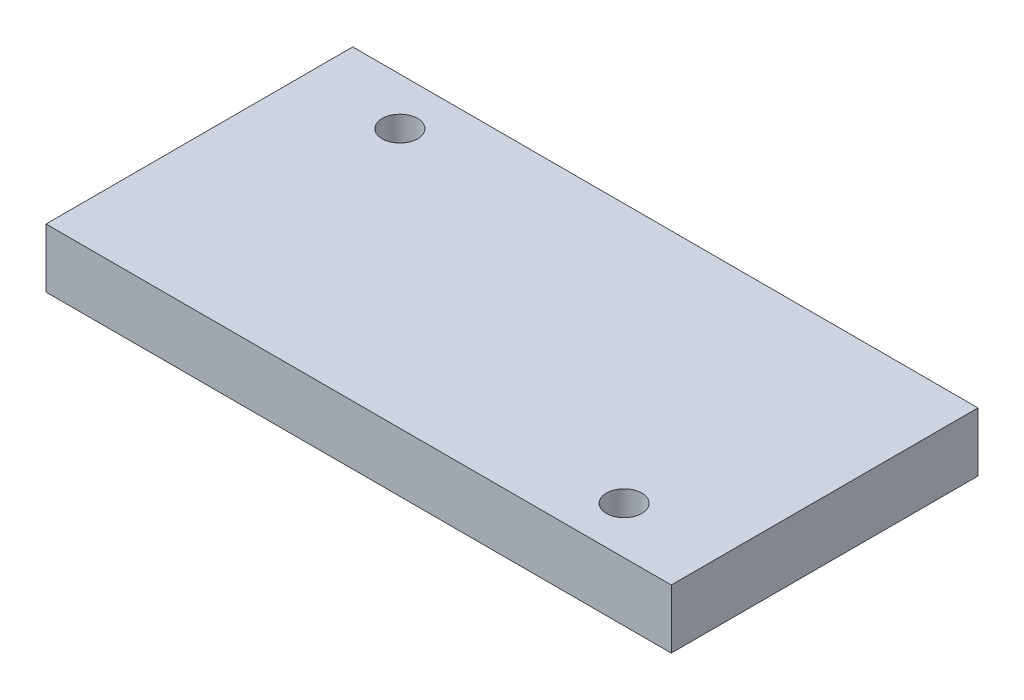
ISO-10303-21;
HEADER;
FILE_DESCRIPTION(('STEP AP214'),'2;1');
FILE_NAME('part.step','',(''),(''),'','','');
FILE_SCHEMA(('AUTOMOTIVE_DESIGN { 1 0 10303 214 1 1 1 1 }'));
ENDSEC;
DATA;
#1=APPLICATION_CONTEXT('core data for automotive mechanical design processes');
#2=APPLICATION_PROTOCOL_DEFINITION('international standard','automotive_design',2000,#1);
#3=PRODUCT_CONTEXT('',#1,'mechanical');
#4=PRODUCT('Part','Part','',(#3));
#5=PRODUCT_RELATED_PRODUCT_CATEGORY('part','',(#4));
#6=PRODUCT_DEFINITION_FORMATION('','',#4);
#7=PRODUCT_DEFINITION_CONTEXT('part definition',#1,'design');
#8=PRODUCT_DEFINITION('design','',#6,#7);
#9=PRODUCT_DEFINITION_SHAPE('','',#8);
#10=(LENGTH_UNIT() NAMED_UNIT(*) SI_UNIT(.MILLI.,.METRE.));
#11=(NAMED_UNIT(*) PLANE_ANGLE_UNIT() SI_UNIT($,.RADIAN.));
#12=(NAMED_UNIT(*) SI_UNIT($,.STERADIAN.) SOLID_ANGLE_UNIT());
#13=UNCERTAINTY_MEASURE_WITH_UNIT(LENGTH_MEASURE(1.E-05),#10,'distance_accuracy_value','');
#14=(GEOMETRIC_REPRESENTATION_CONTEXT(3) GLOBAL_UNCERTAINTY_ASSIGNED_CONTEXT((#13)) GLOBAL_UNIT_ASSIGNED_CONTEXT((#10,
#11,#12)) REPRESENTATION_CONTEXT('',''));
#15=CARTESIAN_POINT('',(0.,0.,0.));
#16=DIRECTION('',(0.,0.,1.));
#17=DIRECTION('',(1.,0.,0.));
#18=AXIS2_PLACEMENT_3D('',#15,#16,#17);
#19=CARTESIAN_POINT('',(26.5,5.,13.));
#20=DIRECTION('',(-1.,0.,0.));
#21=DIRECTION('',(0.,0.,1.));
#22=AXIS2_PLACEMENT_3D('',#19,#20,#21);
#23=PLANE('',#22);
#24=DIRECTION('',(0.,0.,-1.));
#25=VECTOR('',#24,1.);
#26=CARTESIAN_POINT('',(26.5,0.,13.));
#27=LINE('',#26,#25);
#28=CARTESIAN_POINT('',(26.5,0.,13.));
#29=VERTEX_POINT('',#28);
#30=CARTESIAN_POINT('',(26.5,0.,-13.));
#31=VERTEX_POINT('',#30);
#32=EDGE_CURVE('E104',#29,#31,#27,.T.);
#33=ORIENTED_EDGE('',*,*,#32,.T.);
#34=DIRECTION('',(0.,-1.,0.));
#35=VECTOR('',#34,1.);
#36=CARTESIAN_POINT('',(26.5,5.,-13.));
#37=LINE('',#36,#35);
#38=CARTESIAN_POINT('',(26.5,5.,-13.));
#39=VERTEX_POINT('',#38);
#40=EDGE_CURVE('E11',#39,#31,#37,.T.);
#41=ORIENTED_EDGE('',*,*,#40,.F.);
#42=DIRECTION('',(0.,0.,-1.));
#43=VECTOR('',#42,1.);
#44=CARTESIAN_POINT('',(26.5,5.,13.));
#45=LINE('',#44,#43);
#46=CARTESIAN_POINT('',(26.5,5.,13.));
#47=VERTEX_POINT('',#46);
#48=EDGE_CURVE('E91',#47,#39,#45,.T.);
#49=ORIENTED_EDGE('',*,*,#48,.F.);
#50=DIRECTION('',(0.,-1.,0.));
#51=VECTOR('',#50,1.);
#52=CARTESIAN_POINT('',(26.5,5.,13.));
#53=LINE('',#52,#51);
#54=EDGE_CURVE('E100',#47,#29,#53,.T.);
#55=ORIENTED_EDGE('',*,*,#54,.T.);
#56=EDGE_LOOP('',(#33,#41,#49,#55));
#57=FACE_BOUND('',#56,.T.);
#58=ADVANCED_FACE('F38',(#57),#23,.F.);
#59=CARTESIAN_POINT('',(-26.5,5.,-13.));
#60=DIRECTION('',(0.,0.,1.));
#61=DIRECTION('',(1.,0.,0.));
#62=AXIS2_PLACEMENT_3D('',#59,#60,#61);
#63=PLANE('',#62);
#64=DIRECTION('',(-1.,0.,0.));
#65=VECTOR('',#64,1.);
#66=CARTESIAN_POINT('',(-26.5,0.,-13.));
#67=LINE('',#66,#65);
#68=CARTESIAN_POINT('',(-26.5,0.,-13.));
#69=VERTEX_POINT('',#68);
#70=EDGE_CURVE('E95',#31,#69,#67,.T.);
#71=ORIENTED_EDGE('',*,*,#70,.T.);
#72=DIRECTION('',(0.,-1.,0.));
#73=VECTOR('',#72,1.);
#74=CARTESIAN_POINT('',(-26.5,5.,-13.));
#75=LINE('',#74,#73);
#76=CARTESIAN_POINT('',(-26.5,5.,-13.));
#77=VERTEX_POINT('',#76);
#78=EDGE_CURVE('E47',#77,#69,#75,.T.);
#79=ORIENTED_EDGE('',*,*,#78,.F.);
#80=DIRECTION('',(-1.,0.,0.));
#81=VECTOR('',#80,1.);
#82=CARTESIAN_POINT('',(-26.5,5.,-13.));
#83=LINE('',#82,#81);
#84=EDGE_CURVE('E86',#39,#77,#83,.T.);
#85=ORIENTED_EDGE('',*,*,#84,.F.);
#86=ORIENTED_EDGE('',*,*,#40,.T.);
#87=EDGE_LOOP('',(#71,#79,#85,#86));
#88=FACE_BOUND('',#87,.T.);
#89=ADVANCED_FACE('F94',(#88),#63,.F.);
#90=CARTESIAN_POINT('',(-26.5,5.,13.));
#91=DIRECTION('',(1.,0.,0.));
#92=DIRECTION('',(0.,0.,-1.));
#93=AXIS2_PLACEMENT_3D('',#90,#91,#92);
#94=PLANE('',#93);
#95=DIRECTION('',(0.,0.,1.));
#96=VECTOR('',#95,1.);
#97=CARTESIAN_POINT('',(-26.5,0.,13.));
#98=LINE('',#97,#96);
#99=CARTESIAN_POINT('',(-26.5,0.,13.));
#100=VERTEX_POINT('',#99);
#101=EDGE_CURVE('E73',#69,#100,#98,.T.);
#102=ORIENTED_EDGE('',*,*,#101,.T.);
#103=DIRECTION('',(0.,-1.,0.));
#104=VECTOR('',#103,1.);
#105=CARTESIAN_POINT('',(-26.5,5.,13.));
#106=LINE('',#105,#104);
#107=CARTESIAN_POINT('',(-26.5,5.,13.));
#108=VERTEX_POINT('',#107);
#109=EDGE_CURVE('E96',#108,#100,#106,.T.);
#110=ORIENTED_EDGE('',*,*,#109,.F.);
#111=DIRECTION('',(0.,0.,1.));
#112=VECTOR('',#111,1.);
#113=CARTESIAN_POINT('',(-26.5,5.,13.));
#114=LINE('',#113,#112);
#115=EDGE_CURVE('E89',#77,#108,#114,.T.);
#116=ORIENTED_EDGE('',*,*,#115,.F.);
#117=ORIENTED_EDGE('',*,*,#78,.T.);
#118=EDGE_LOOP('',(#102,#110,#116,#117));
#119=FACE_BOUND('',#118,.T.);
#120=ADVANCED_FACE('F98',(#119),#94,.F.);
#121=CARTESIAN_POINT('',(-26.5,5.,13.));
#122=DIRECTION('',(0.,0.,-1.));
#123=DIRECTION('',(-1.,0.,0.));
#124=AXIS2_PLACEMENT_3D('',#121,#122,#123);
#125=PLANE('',#124);
#126=DIRECTION('',(1.,0.,0.));
#127=VECTOR('',#126,1.);
#128=CARTESIAN_POINT('',(-26.5,0.,13.));
#129=LINE('',#128,#127);
#130=EDGE_CURVE('E79',#100,#29,#129,.T.);
#131=ORIENTED_EDGE('',*,*,#130,.T.);
#132=ORIENTED_EDGE('',*,*,#54,.F.);
#133=DIRECTION('',(1.,0.,0.));
#134=VECTOR('',#133,1.);
#135=CARTESIAN_POINT('',(-26.5,5.,13.));
#136=LINE('',#135,#134);
#137=EDGE_CURVE('E56',#108,#47,#136,.T.);
#138=ORIENTED_EDGE('',*,*,#137,.F.);
#139=ORIENTED_EDGE('',*,*,#109,.T.);
#140=EDGE_LOOP('',(#131,#132,#138,#139));
#141=FACE_BOUND('',#140,.T.);
#142=ADVANCED_FACE('F130',(#141),#125,.F.);
#143=CARTESIAN_POINT('',(0.,5.,0.));
#144=DIRECTION('',(0.,-1.,0.));
#145=DIRECTION('',(0.,0.,-1.));
#146=AXIS2_PLACEMENT_3D('',#143,#144,#145);
#147=PLANE('',#146);
#148=CARTESIAN_POINT('',(-18.5,5.,-9.));
#149=DIRECTION('',(0.,1.,0.));
#150=DIRECTION('',(0.,0.,1.));
#151=AXIS2_PLACEMENT_3D('',#148,#149,#150);
#152=CIRCLE('',#151,1.5);
#153=CARTESIAN_POINT('',(-18.5,5.,-7.49999999999999));
#154=VERTEX_POINT('',#153);
#155=EDGE_CURVE('E113',#154,#154,#152,.T.);
#156=ORIENTED_EDGE('',*,*,#155,.F.);
#157=EDGE_LOOP('',(#156));
#158=FACE_BOUND('',#157,.T.);
#159=CARTESIAN_POINT('',(18.5,5.,9.));
#160=DIRECTION('',(0.,1.,0.));
#161=DIRECTION('',(0.,0.,1.));
#162=AXIS2_PLACEMENT_3D('',#159,#160,#161);
#163=CIRCLE('',#162,1.5);
#164=CARTESIAN_POINT('',(18.5,5.,10.5));
#165=VERTEX_POINT('',#164);
#166=EDGE_CURVE('E118',#165,#165,#163,.T.);
#167=ORIENTED_EDGE('',*,*,#166,.F.);
#168=EDGE_LOOP('',(#167));
#169=FACE_BOUND('',#168,.T.);
#170=ORIENTED_EDGE('',*,*,#48,.T.);
#171=ORIENTED_EDGE('',*,*,#84,.T.);
#172=ORIENTED_EDGE('',*,*,#115,.T.);
#173=ORIENTED_EDGE('',*,*,#137,.T.);
#174=EDGE_LOOP('',(#170,#171,#172,#173));
#175=FACE_BOUND('',#174,.T.);
#176=ADVANCED_FACE('F87',(#158,#169,#175),#147,.F.);
#177=CARTESIAN_POINT('',(0.,0.,0.));
#178=DIRECTION('',(0.,-1.,0.));
#179=DIRECTION('',(0.,0.,-1.));
#180=AXIS2_PLACEMENT_3D('',#177,#178,#179);
#181=PLANE('',#180);
#182=CARTESIAN_POINT('',(-18.5,0.,-9.));
#183=DIRECTION('',(0.,-1.,0.));
#184=DIRECTION('',(0.,0.,-1.));
#185=AXIS2_PLACEMENT_3D('',#182,#183,#184);
#186=CIRCLE('',#185,1.5);
#187=CARTESIAN_POINT('',(-18.5,0.,-7.49999999999999));
#188=VERTEX_POINT('',#187);
#189=EDGE_CURVE('E41',#188,#188,#186,.T.);
#190=ORIENTED_EDGE('',*,*,#189,.F.);
#191=EDGE_LOOP('',(#190));
#192=FACE_BOUND('',#191,.T.);
#193=CARTESIAN_POINT('',(18.5,0.,9.));
#194=DIRECTION('',(0.,-1.,0.));
#195=DIRECTION('',(0.,0.,-1.));
#196=AXIS2_PLACEMENT_3D('',#193,#194,#195);
#197=CIRCLE('',#196,1.5);
#198=CARTESIAN_POINT('',(18.5,0.,10.5));
#199=VERTEX_POINT('',#198);
#200=EDGE_CURVE('E111',#199,#199,#197,.T.);
#201=ORIENTED_EDGE('',*,*,#200,.F.);
#202=EDGE_LOOP('',(#201));
#203=FACE_BOUND('',#202,.T.);
#204=ORIENTED_EDGE('',*,*,#32,.F.);
#205=ORIENTED_EDGE('',*,*,#130,.F.);
#206=ORIENTED_EDGE('',*,*,#101,.F.);
#207=ORIENTED_EDGE('',*,*,#70,.F.);
#208=EDGE_LOOP('',(#204,#205,#206,#207));
#209=FACE_BOUND('',#208,.T.);
#210=ADVANCED_FACE('F129',(#192,#203,#209),#181,.T.);
#211=CARTESIAN_POINT('',(18.5,-8.,9.));
#212=DIRECTION('',(0.,1.,0.));
#213=DIRECTION('',(0.,0.,1.));
#214=AXIS2_PLACEMENT_3D('',#211,#212,#213);
#215=CYLINDRICAL_SURFACE('',#214,1.5);
#216=CARTESIAN_POINT('',(18.5,0.,10.5));
#217=CARTESIAN_POINT('',(18.5,0.0520833333333351,10.5));
#218=CARTESIAN_POINT('',(18.5,0.104166666666669,10.5));
#219=CARTESIAN_POINT('',(18.5,0.208333333333335,10.5));
#220=CARTESIAN_POINT('',(18.5,0.260416666666669,10.5));
#221=CARTESIAN_POINT('',(18.5,0.364583333333335,10.5));
#222=CARTESIAN_POINT('',(18.5,0.416666666666669,10.5));
#223=CARTESIAN_POINT('',(18.5,0.520833333333335,10.5));
#224=CARTESIAN_POINT('',(18.5,0.572916666666669,10.5));
#225=CARTESIAN_POINT('',(18.5,0.677083333333335,10.5));
#226=CARTESIAN_POINT('',(18.5,0.729166666666668,10.5));
#227=CARTESIAN_POINT('',(18.5,0.833333333333334,10.5));
#228=CARTESIAN_POINT('',(18.5,0.885416666666668,10.5));
#229=CARTESIAN_POINT('',(18.5,0.989583333333334,10.5));
#230=CARTESIAN_POINT('',(18.5,1.04166666666667,10.5));
#231=CARTESIAN_POINT('',(18.5,1.14583333333333,10.5));
#232=CARTESIAN_POINT('',(18.5,1.19791666666667,10.5));
#233=CARTESIAN_POINT('',(18.5,1.30208333333333,10.5));
#234=CARTESIAN_POINT('',(18.5,1.35416666666667,10.5));
#235=CARTESIAN_POINT('',(18.5,1.45833333333333,10.5));
#236=CARTESIAN_POINT('',(18.5,1.51041666666667,10.5));
#237=CARTESIAN_POINT('',(18.5,1.61458333333333,10.5));
#238=CARTESIAN_POINT('',(18.5,1.66666666666667,10.5));
#239=CARTESIAN_POINT('',(18.5,1.77083333333333,10.5));
#240=CARTESIAN_POINT('',(18.5,1.82291666666667,10.5));
#241=CARTESIAN_POINT('',(18.5,1.92708333333333,10.5));
#242=CARTESIAN_POINT('',(18.5,1.97916666666667,10.5));
#243=CARTESIAN_POINT('',(18.5,2.08333333333333,10.5));
#244=CARTESIAN_POINT('',(18.5,2.13541666666667,10.5));
#245=CARTESIAN_POINT('',(18.5,2.23958333333333,10.5));
#246=CARTESIAN_POINT('',(18.5,2.29166666666667,10.5));
#247=CARTESIAN_POINT('',(18.5,2.39583333333333,10.5));
#248=CARTESIAN_POINT('',(18.5,2.44791666666667,10.5));
#249=CARTESIAN_POINT('',(18.5,2.55208333333333,10.5));
#250=CARTESIAN_POINT('',(18.5,2.60416666666667,10.5));
#251=CARTESIAN_POINT('',(18.5,2.70833333333333,10.5));
#252=CARTESIAN_POINT('',(18.5,2.76041666666667,10.5));
#253=CARTESIAN_POINT('',(18.5,2.86458333333333,10.5));
#254=CARTESIAN_POINT('',(18.5,2.91666666666667,10.5));
#255=CARTESIAN_POINT('',(18.5,3.02083333333333,10.5));
#256=CARTESIAN_POINT('',(18.5,3.07291666666667,10.5));
#257=CARTESIAN_POINT('',(18.5,3.17708333333333,10.5));
#258=CARTESIAN_POINT('',(18.5,3.22916666666667,10.5));
#259=CARTESIAN_POINT('',(18.5,3.33333333333333,10.5));
#260=CARTESIAN_POINT('',(18.5,3.38541666666667,10.5));
#261=CARTESIAN_POINT('',(18.5,3.48958333333333,10.5));
#262=CARTESIAN_POINT('',(18.5,3.54166666666667,10.5));
#263=CARTESIAN_POINT('',(18.5,3.64583333333333,10.5));
#264=CARTESIAN_POINT('',(18.5,3.69791666666667,10.5));
#265=CARTESIAN_POINT('',(18.5,3.80208333333333,10.5));
#266=CARTESIAN_POINT('',(18.5,3.85416666666667,10.5));
#267=CARTESIAN_POINT('',(18.5,3.95833333333333,10.5));
#268=CARTESIAN_POINT('',(18.5,4.01041666666667,10.5));
#269=CARTESIAN_POINT('',(18.5,4.11458333333333,10.5));
#270=CARTESIAN_POINT('',(18.5,4.16666666666667,10.5));
#271=CARTESIAN_POINT('',(18.5,4.27083333333333,10.5));
#272=CARTESIAN_POINT('',(18.5,4.32291666666667,10.5));
#273=CARTESIAN_POINT('',(18.5,4.42708333333333,10.5));
#274=CARTESIAN_POINT('',(18.5,4.47916666666667,10.5));
#275=CARTESIAN_POINT('',(18.5,4.58333333333333,10.5));
#276=CARTESIAN_POINT('',(18.5,4.63541666666667,10.5));
#277=CARTESIAN_POINT('',(18.5,4.73958333333333,10.5));
#278=CARTESIAN_POINT('',(18.5,4.79166666666667,10.5));
#279=CARTESIAN_POINT('',(18.5,4.89583333333333,10.5));
#280=CARTESIAN_POINT('',(18.5,4.94791666666667,10.5));
#281=CARTESIAN_POINT('',(18.5,5.,10.5));
#282=B_SPLINE_CURVE_WITH_KNOTS('',3,(#216,#217,#218,#219,#220,#221,#222,#223,#224,#225,#226,
#227,#228,#229,#230,#231,#232,#233,#234,#235,#236,#237,#238,#239,#240,#241,#242,#243,#244,#245,
#246,#247,#248,#249,#250,#251,#252,#253,#254,#255,#256,#257,#258,#259,#260,#261,#262,#263,#264,
#265,#266,#267,#268,#269,#270,#271,#272,#273,#274,#275,#276,#277,#278,#279,#280,#281),
.UNSPECIFIED.,.F.,.F.,(4,2,2,2,2,2,2,2,2,2,2,2,2,2,2,2,2,2,2,2,2,2,2,2,2,2,2,2,2,2,2,2,4),(0.,
0.15625,0.3125,0.46875,0.625000000000001,0.781249999999999,0.937499999999999,1.09375,1.25,
1.40625,1.5625,1.71875,1.875,2.03125,2.1875,2.34375,2.5,2.65625,2.8125,2.96875,3.125,3.28125,
3.4375,3.59375,3.75,3.90625,4.0625,4.21875,4.375,4.53125,4.6875,4.84375,5.),.UNSPECIFIED.);
#283=EDGE_CURVE('BSEAM126',#199,#165,#282,.T.);
#284=ORIENTED_EDGE('',*,*,#200,.T.);
#285=ORIENTED_EDGE('',*,*,#166,.T.);
#286=ORIENTED_EDGE('',*,*,#283,.T.);
#287=ORIENTED_EDGE('',*,*,#283,.F.);
#288=EDGE_LOOP('',(#284,#286,#285,#287));
#289=FACE_BOUND('',#288,.T.);
#290=ADVANCED_FACE('F126',(#289),#215,.F.);
#291=CARTESIAN_POINT('',(-18.5,-8.,-9.));
#292=DIRECTION('',(0.,1.,0.));
#293=DIRECTION('',(0.,0.,1.));
#294=AXIS2_PLACEMENT_3D('',#291,#292,#293);
#295=CYLINDRICAL_SURFACE('',#294,1.5);
#296=CARTESIAN_POINT('',(-18.5,0.,-7.49999999999999));
#297=CARTESIAN_POINT('',(-18.5,0.0520833333333351,-7.49999999999999));
#298=CARTESIAN_POINT('',(-18.5,0.104166666666669,-7.49999999999999));
#299=CARTESIAN_POINT('',(-18.5,0.208333333333335,-7.49999999999999));
#300=CARTESIAN_POINT('',(-18.5,0.260416666666669,-7.49999999999999));
#301=CARTESIAN_POINT('',(-18.5,0.364583333333335,-7.49999999999999));
#302=CARTESIAN_POINT('',(-18.5,0.416666666666669,-7.49999999999999));
#303=CARTESIAN_POINT('',(-18.5,0.520833333333335,-7.49999999999999));
#304=CARTESIAN_POINT('',(-18.5,0.572916666666669,-7.49999999999999));
#305=CARTESIAN_POINT('',(-18.5,0.677083333333335,-7.49999999999999));
#306=CARTESIAN_POINT('',(-18.5,0.729166666666668,-7.49999999999999));
#307=CARTESIAN_POINT('',(-18.5,0.833333333333334,-7.49999999999999));
#308=CARTESIAN_POINT('',(-18.5,0.885416666666668,-7.49999999999999));
#309=CARTESIAN_POINT('',(-18.5,0.989583333333334,-7.49999999999999));
#310=CARTESIAN_POINT('',(-18.5,1.04166666666667,-7.49999999999999));
#311=CARTESIAN_POINT('',(-18.5,1.14583333333333,-7.49999999999999));
#312=CARTESIAN_POINT('',(-18.5,1.19791666666667,-7.49999999999999));
#313=CARTESIAN_POINT('',(-18.5,1.30208333333333,-7.49999999999999));
#314=CARTESIAN_POINT('',(-18.5,1.35416666666667,-7.49999999999999));
#315=CARTESIAN_POINT('',(-18.5,1.45833333333333,-7.49999999999999));
#316=CARTESIAN_POINT('',(-18.5,1.51041666666667,-7.49999999999999));
#317=CARTESIAN_POINT('',(-18.5,1.61458333333333,-7.49999999999999));
#318=CARTESIAN_POINT('',(-18.5,1.66666666666667,-7.49999999999999));
#319=CARTESIAN_POINT('',(-18.5,1.77083333333333,-7.49999999999999));
#320=CARTESIAN_POINT('',(-18.5,1.82291666666667,-7.49999999999999));
#321=CARTESIAN_POINT('',(-18.5,1.92708333333333,-7.49999999999999));
#322=CARTESIAN_POINT('',(-18.5,1.97916666666667,-7.49999999999999));
#323=CARTESIAN_POINT('',(-18.5,2.08333333333333,-7.49999999999999));
#324=CARTESIAN_POINT('',(-18.5,2.13541666666667,-7.49999999999999));
#325=CARTESIAN_POINT('',(-18.5,2.23958333333333,-7.49999999999999));
#326=CARTESIAN_POINT('',(-18.5,2.29166666666667,-7.49999999999999));
#327=CARTESIAN_POINT('',(-18.5,2.39583333333333,-7.49999999999999));
#328=CARTESIAN_POINT('',(-18.5,2.44791666666667,-7.49999999999999));
#329=CARTESIAN_POINT('',(-18.5,2.55208333333333,-7.49999999999999));
#330=CARTESIAN_POINT('',(-18.5,2.60416666666667,-7.49999999999999));
#331=CARTESIAN_POINT('',(-18.5,2.70833333333333,-7.49999999999999));
#332=CARTESIAN_POINT('',(-18.5,2.76041666666667,-7.49999999999999));
#333=CARTESIAN_POINT('',(-18.5,2.86458333333333,-7.49999999999999));
#334=CARTESIAN_POINT('',(-18.5,2.91666666666667,-7.49999999999999));
#335=CARTESIAN_POINT('',(-18.5,3.02083333333333,-7.49999999999999));
#336=CARTESIAN_POINT('',(-18.5,3.07291666666667,-7.49999999999999));
#337=CARTESIAN_POINT('',(-18.5,3.17708333333333,-7.49999999999999));
#338=CARTESIAN_POINT('',(-18.5,3.22916666666667,-7.49999999999999));
#339=CARTESIAN_POINT('',(-18.5,3.33333333333333,-7.49999999999999));
#340=CARTESIAN_POINT('',(-18.5,3.38541666666667,-7.49999999999999));
#341=CARTESIAN_POINT('',(-18.5,3.48958333333333,-7.49999999999999));
#342=CARTESIAN_POINT('',(-18.5,3.54166666666667,-7.49999999999999));
#343=CARTESIAN_POINT('',(-18.5,3.64583333333333,-7.49999999999999));
#344=CARTESIAN_POINT('',(-18.5,3.69791666666667,-7.49999999999999));
#345=CARTESIAN_POINT('',(-18.5,3.80208333333333,-7.49999999999999));
#346=CARTESIAN_POINT('',(-18.5,3.85416666666667,-7.49999999999999));
#347=CARTESIAN_POINT('',(-18.5,3.95833333333333,-7.49999999999999));
#348=CARTESIAN_POINT('',(-18.5,4.01041666666667,-7.49999999999999));
#349=CARTESIAN_POINT('',(-18.5,4.11458333333333,-7.49999999999999));
#350=CARTESIAN_POINT('',(-18.5,4.16666666666667,-7.49999999999999));
#351=CARTESIAN_POINT('',(-18.5,4.27083333333333,-7.49999999999999));
#352=CARTESIAN_POINT('',(-18.5,4.32291666666667,-7.49999999999999));
#353=CARTESIAN_POINT('',(-18.5,4.42708333333333,-7.49999999999999));
#354=CARTESIAN_POINT('',(-18.5,4.47916666666667,-7.49999999999999));
#355=CARTESIAN_POINT('',(-18.5,4.58333333333333,-7.49999999999999));
#356=CARTESIAN_POINT('',(-18.5,4.63541666666667,-7.49999999999999));
#357=CARTESIAN_POINT('',(-18.5,4.73958333333333,-7.49999999999999));
#358=CARTESIAN_POINT('',(-18.5,4.79166666666667,-7.49999999999999));
#359=CARTESIAN_POINT('',(-18.5,4.89583333333333,-7.49999999999999));
#360=CARTESIAN_POINT('',(-18.5,4.94791666666667,-7.49999999999999));
#361=CARTESIAN_POINT('',(-18.5,5.,-7.49999999999999));
#362=B_SPLINE_CURVE_WITH_KNOTS('',3,(#296,#297,#298,#299,#300,#301,#302,#303,#304,#305,#306,
#307,#308,#309,#310,#311,#312,#313,#314,#315,#316,#317,#318,#319,#320,#321,#322,#323,#324,#325,
#326,#327,#328,#329,#330,#331,#332,#333,#334,#335,#336,#337,#338,#339,#340,#341,#342,#343,#344,
#345,#346,#347,#348,#349,#350,#351,#352,#353,#354,#355,#356,#357,#358,#359,#360,#361),
.UNSPECIFIED.,.F.,.F.,(4,2,2,2,2,2,2,2,2,2,2,2,2,2,2,2,2,2,2,2,2,2,2,2,2,2,2,2,2,2,2,2,4),(0.,
0.15625,0.3125,0.46875,0.625000000000001,0.781249999999999,0.937499999999999,1.09375,1.25,
1.40625,1.5625,1.71875,1.875,2.03125,2.1875,2.34375,2.5,2.65625,2.8125,2.96875,3.125,3.28125,
3.4375,3.59375,3.75,3.90625,4.0625,4.21875,4.375,4.53125,4.6875,4.84375,5.),.UNSPECIFIED.);
#363=EDGE_CURVE('BSEAM177',#188,#154,#362,.T.);
#364=ORIENTED_EDGE('',*,*,#189,.T.);
#365=ORIENTED_EDGE('',*,*,#155,.T.);
#366=ORIENTED_EDGE('',*,*,#363,.T.);
#367=ORIENTED_EDGE('',*,*,#363,.F.);
#368=EDGE_LOOP('',(#364,#366,#365,#367));
#369=FACE_BOUND('',#368,.T.);
#370=ADVANCED_FACE('F177',(#369),#295,.F.);
#371=CLOSED_SHELL('',(#58,#89,#120,#142,#176,#210,#290,#370));
#372=MANIFOLD_SOLID_BREP('B2',#371);
#373=ADVANCED_BREP_SHAPE_REPRESENTATION('',(#18,#372),#14);
#374=SHAPE_DEFINITION_REPRESENTATION(#9,#373);
ENDSEC;
END-ISO-10303-21;
